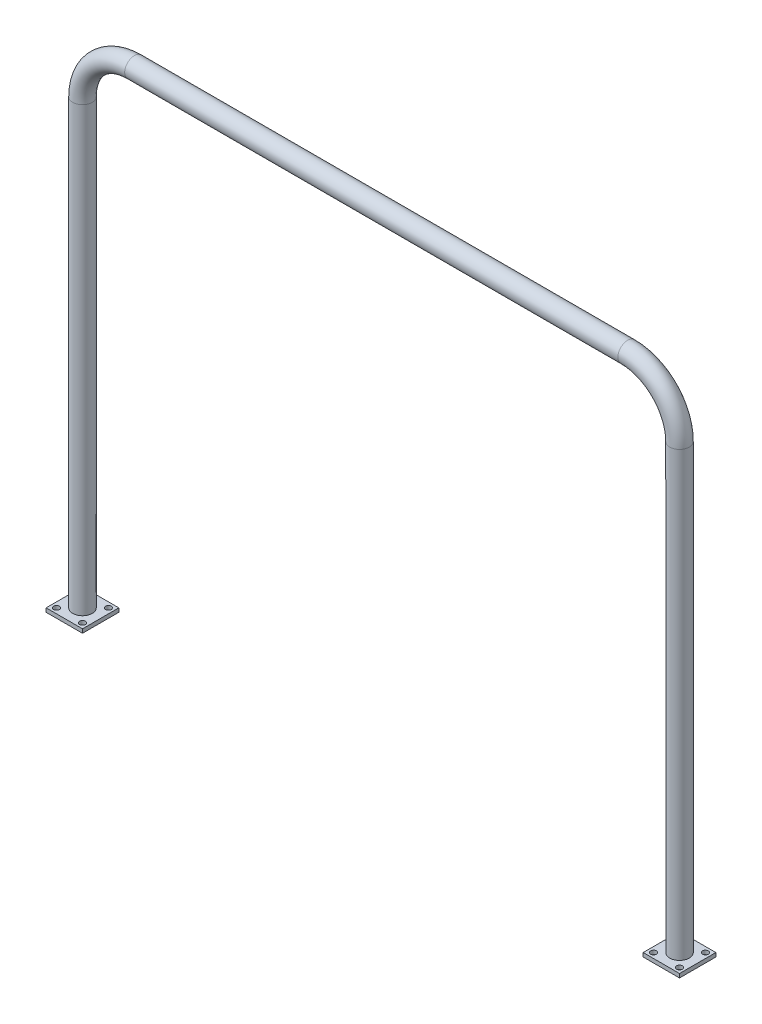
ISO-10303-21;
HEADER;
FILE_DESCRIPTION(('STEP AP214'),'2;1');
FILE_NAME('part.step','',(''),(''),'','','');
FILE_SCHEMA(('AUTOMOTIVE_DESIGN { 1 0 10303 214 1 1 1 1 }'));
ENDSEC;
DATA;
#1=APPLICATION_CONTEXT('core data for automotive mechanical design processes');
#2=APPLICATION_PROTOCOL_DEFINITION('international standard','automotive_design',2000,#1);
#3=PRODUCT_CONTEXT('',#1,'mechanical');
#4=PRODUCT('Part','Part','',(#3));
#5=PRODUCT_RELATED_PRODUCT_CATEGORY('part','',(#4));
#6=PRODUCT_DEFINITION_FORMATION('','',#4);
#7=PRODUCT_DEFINITION_CONTEXT('part definition',#1,'design');
#8=PRODUCT_DEFINITION('design','',#6,#7);
#9=PRODUCT_DEFINITION_SHAPE('','',#8);
#10=(LENGTH_UNIT() NAMED_UNIT(*) SI_UNIT(.MILLI.,.METRE.));
#11=(NAMED_UNIT(*) PLANE_ANGLE_UNIT() SI_UNIT($,.RADIAN.));
#12=(NAMED_UNIT(*) SI_UNIT($,.STERADIAN.) SOLID_ANGLE_UNIT());
#13=UNCERTAINTY_MEASURE_WITH_UNIT(LENGTH_MEASURE(1.E-05),#10,'distance_accuracy_value','');
#14=(GEOMETRIC_REPRESENTATION_CONTEXT(3) GLOBAL_UNCERTAINTY_ASSIGNED_CONTEXT((#13)) GLOBAL_UNIT_ASSIGNED_CONTEXT((#10,
#11,#12)) REPRESENTATION_CONTEXT('',''));
#15=CARTESIAN_POINT('',(0.,0.,0.));
#16=DIRECTION('',(0.,0.,1.));
#17=DIRECTION('',(1.,0.,0.));
#18=AXIS2_PLACEMENT_3D('',#15,#16,#17);
#19=CARTESIAN_POINT('',(-460.,0.,0.));
#20=DIRECTION('',(0.,1.,0.));
#21=DIRECTION('',(-1.,0.,0.));
#22=AXIS2_PLACEMENT_3D('',#19,#20,#21);
#23=CYLINDRICAL_SURFACE('',#22,15.);
#24=CARTESIAN_POINT('',(-460.000000000001,682.,0.));
#25=DIRECTION('',(0.,1.,0.));
#26=DIRECTION('',(0.,0.,1.));
#27=AXIS2_PLACEMENT_3D('',#24,#25,#26);
#28=CIRCLE('',#27,15.);
#29=CARTESIAN_POINT('',(-475.000000000001,681.999999999999,0.));
#30=VERTEX_POINT('',#29);
#31=EDGE_CURVE('E245',#30,#30,#28,.T.);
#32=ORIENTED_EDGE('',*,*,#31,.F.);
#33=EDGE_LOOP('',(#32));
#34=FACE_BOUND('',#33,.T.);
#35=CARTESIAN_POINT('',(-460.,0.,0.));
#36=DIRECTION('',(0.,1.,0.));
#37=DIRECTION('',(0.,0.,1.));
#38=AXIS2_PLACEMENT_3D('',#35,#36,#37);
#39=CIRCLE('',#38,15.);
#40=CARTESIAN_POINT('',(-460.,0.,15.));
#41=VERTEX_POINT('',#40);
#42=EDGE_CURVE('E233',#41,#41,#39,.T.);
#43=ORIENTED_EDGE('',*,*,#42,.T.);
#44=EDGE_LOOP('',(#43));
#45=FACE_BOUND('',#44,.T.);
#46=ADVANCED_FACE('F43',(#34,#45),#23,.T.);
#47=CARTESIAN_POINT('',(-380.,682.,0.));
#48=DIRECTION('',(0.,0.,-1.));
#49=DIRECTION('',(-1.,0.,0.));
#50=AXIS2_PLACEMENT_3D('',#47,#48,#49);
#51=TOROIDAL_SURFACE('',#50,80.0000000000003,15.);
#52=CARTESIAN_POINT('',(-380.,762.,0.));
#53=DIRECTION('',(1.,0.,0.));
#54=DIRECTION('',(0.,0.,1.));
#55=AXIS2_PLACEMENT_3D('',#52,#53,#54);
#56=CIRCLE('',#55,15.);
#57=CARTESIAN_POINT('',(-380.,777.,0.));
#58=VERTEX_POINT('',#57);
#59=EDGE_CURVE('E249',#58,#58,#56,.T.);
#60=CARTESIAN_POINT('',(-380.,682.,0.));
#61=DIRECTION('',(0.,0.,-1.));
#62=DIRECTION('',(-1.,0.,0.));
#63=AXIS2_PLACEMENT_3D('',#60,#61,#62);
#64=CIRCLE('',#63,95.0000000000003);
#65=EDGE_CURVE('',#30,#58,#64,.T.);
#66=ORIENTED_EDGE('',*,*,#31,.T.);
#67=ORIENTED_EDGE('',*,*,#59,.F.);
#68=ORIENTED_EDGE('',*,*,#65,.T.);
#69=ORIENTED_EDGE('',*,*,#65,.F.);
#70=EDGE_LOOP('',(#66,#68,#67,#69));
#71=FACE_BOUND('',#70,.T.);
#72=ADVANCED_FACE('F270',(#71),#51,.T.);
#73=CARTESIAN_POINT('',(-380.,762.,0.));
#74=DIRECTION('',(1.,0.,0.));
#75=DIRECTION('',(0.,0.,-1.));
#76=AXIS2_PLACEMENT_3D('',#73,#74,#75);
#77=CYLINDRICAL_SURFACE('',#76,15.);
#78=CARTESIAN_POINT('',(379.999999999999,762.,0.));
#79=DIRECTION('',(1.,0.,0.));
#80=DIRECTION('',(0.,0.,1.));
#81=AXIS2_PLACEMENT_3D('',#78,#79,#80);
#82=CIRCLE('',#81,15.);
#83=CARTESIAN_POINT('',(379.999999999999,777.,0.));
#84=VERTEX_POINT('',#83);
#85=EDGE_CURVE('E253',#84,#84,#82,.T.);
#86=ORIENTED_EDGE('',*,*,#85,.F.);
#87=EDGE_LOOP('',(#86));
#88=FACE_BOUND('',#87,.T.);
#89=ORIENTED_EDGE('',*,*,#59,.T.);
#90=EDGE_LOOP('',(#89));
#91=FACE_BOUND('',#90,.T.);
#92=ADVANCED_FACE('F265',(#88,#91),#77,.T.);
#93=CARTESIAN_POINT('',(380.,682.,0.));
#94=DIRECTION('',(0.,0.,-1.));
#95=DIRECTION('',(-1.,0.,0.));
#96=AXIS2_PLACEMENT_3D('',#93,#94,#95);
#97=TOROIDAL_SURFACE('',#96,80.0000000000003,15.);
#98=CARTESIAN_POINT('',(460.,682.,0.));
#99=DIRECTION('',(0.,-1.,0.));
#100=DIRECTION('',(0.,0.,1.));
#101=AXIS2_PLACEMENT_3D('',#98,#99,#100);
#102=CIRCLE('',#101,15.);
#103=CARTESIAN_POINT('',(475.,682.,0.));
#104=VERTEX_POINT('',#103);
#105=EDGE_CURVE('E54',#104,#104,#102,.T.);
#106=CARTESIAN_POINT('',(380.,682.,0.));
#107=DIRECTION('',(0.,0.,-1.));
#108=DIRECTION('',(-1.,0.,0.));
#109=AXIS2_PLACEMENT_3D('',#106,#107,#108);
#110=CIRCLE('',#109,95.0000000000003);
#111=EDGE_CURVE('',#84,#104,#110,.T.);
#112=ORIENTED_EDGE('',*,*,#85,.T.);
#113=ORIENTED_EDGE('',*,*,#105,.F.);
#114=ORIENTED_EDGE('',*,*,#111,.T.);
#115=ORIENTED_EDGE('',*,*,#111,.F.);
#116=EDGE_LOOP('',(#112,#114,#113,#115));
#117=FACE_BOUND('',#116,.T.);
#118=ADVANCED_FACE('F262',(#117),#97,.T.);
#119=CARTESIAN_POINT('',(460.,682.,0.));
#120=DIRECTION('',(0.,-1.,0.));
#121=DIRECTION('',(1.,0.,0.));
#122=AXIS2_PLACEMENT_3D('',#119,#120,#121);
#123=CYLINDRICAL_SURFACE('',#122,15.);
#124=CARTESIAN_POINT('',(460.,-1.12324616860903E-13,0.));
#125=DIRECTION('',(0.,-1.,0.));
#126=DIRECTION('',(0.,0.,1.));
#127=AXIS2_PLACEMENT_3D('',#124,#125,#126);
#128=CIRCLE('',#127,15.);
#129=CARTESIAN_POINT('',(460.,-1.12324616860903E-13,15.));
#130=VERTEX_POINT('',#129);
#131=EDGE_CURVE('E11',#130,#130,#128,.T.);
#132=ORIENTED_EDGE('',*,*,#131,.F.);
#133=EDGE_LOOP('',(#132));
#134=FACE_BOUND('',#133,.T.);
#135=ORIENTED_EDGE('',*,*,#105,.T.);
#136=EDGE_LOOP('',(#135));
#137=FACE_BOUND('',#136,.T.);
#138=ADVANCED_FACE('F45',(#134,#137),#123,.T.);
#139=CARTESIAN_POINT('',(-488.,-6.,-28.));
#140=DIRECTION('',(-1.,0.,0.));
#141=DIRECTION('',(0.,0.,1.));
#142=AXIS2_PLACEMENT_3D('',#139,#140,#141);
#143=PLANE('',#142);
#144=DIRECTION('',(0.,0.,1.));
#145=VECTOR('',#144,1.);
#146=CARTESIAN_POINT('',(-488.,0.,-28.));
#147=LINE('',#146,#145);
#148=CARTESIAN_POINT('',(-488.,0.,-28.));
#149=VERTEX_POINT('',#148);
#150=CARTESIAN_POINT('',(-488.,0.,28.));
#151=VERTEX_POINT('',#150);
#152=EDGE_CURVE('E205',#149,#151,#147,.T.);
#153=ORIENTED_EDGE('',*,*,#152,.F.);
#154=DIRECTION('',(0.,1.,0.));
#155=VECTOR('',#154,1.);
#156=CARTESIAN_POINT('',(-488.,-6.,-28.));
#157=LINE('',#156,#155);
#158=CARTESIAN_POINT('',(-488.,-6.,-28.));
#159=VERTEX_POINT('',#158);
#160=EDGE_CURVE('E62',#159,#149,#157,.T.);
#161=ORIENTED_EDGE('',*,*,#160,.F.);
#162=DIRECTION('',(0.,0.,1.));
#163=VECTOR('',#162,1.);
#164=CARTESIAN_POINT('',(-488.,-6.,-28.));
#165=LINE('',#164,#163);
#166=CARTESIAN_POINT('',(-488.,-6.,28.));
#167=VERTEX_POINT('',#166);
#168=EDGE_CURVE('E206',#159,#167,#165,.T.);
#169=ORIENTED_EDGE('',*,*,#168,.T.);
#170=DIRECTION('',(0.,1.,0.));
#171=VECTOR('',#170,1.);
#172=CARTESIAN_POINT('',(-488.,-6.,28.));
#173=LINE('',#172,#171);
#174=EDGE_CURVE('E88',#167,#151,#173,.T.);
#175=ORIENTED_EDGE('',*,*,#174,.T.);
#176=EDGE_LOOP('',(#153,#161,#169,#175));
#177=FACE_BOUND('',#176,.T.);
#178=ADVANCED_FACE('F282',(#177),#143,.T.);
#179=CARTESIAN_POINT('',(-488.,-6.,-28.));
#180=DIRECTION('',(0.,0.,1.));
#181=DIRECTION('',(1.,0.,0.));
#182=AXIS2_PLACEMENT_3D('',#179,#180,#181);
#183=PLANE('',#182);
#184=DIRECTION('',(1.,0.,0.));
#185=VECTOR('',#184,1.);
#186=CARTESIAN_POINT('',(-488.,0.,-28.));
#187=LINE('',#186,#185);
#188=CARTESIAN_POINT('',(-432.,0.,-28.));
#189=VERTEX_POINT('',#188);
#190=EDGE_CURVE('E80',#149,#189,#187,.T.);
#191=ORIENTED_EDGE('',*,*,#190,.T.);
#192=DIRECTION('',(0.,1.,0.));
#193=VECTOR('',#192,1.);
#194=CARTESIAN_POINT('',(-432.,-6.,-28.));
#195=LINE('',#194,#193);
#196=CARTESIAN_POINT('',(-432.,-6.,-28.));
#197=VERTEX_POINT('',#196);
#198=EDGE_CURVE('E234',#197,#189,#195,.T.);
#199=ORIENTED_EDGE('',*,*,#198,.F.);
#200=DIRECTION('',(1.,0.,0.));
#201=VECTOR('',#200,1.);
#202=CARTESIAN_POINT('',(-488.,-6.,-28.));
#203=LINE('',#202,#201);
#204=EDGE_CURVE('E215',#159,#197,#203,.T.);
#205=ORIENTED_EDGE('',*,*,#204,.F.);
#206=ORIENTED_EDGE('',*,*,#160,.T.);
#207=EDGE_LOOP('',(#191,#199,#205,#206));
#208=FACE_BOUND('',#207,.T.);
#209=ADVANCED_FACE('F299',(#208),#183,.F.);
#210=CARTESIAN_POINT('',(-432.,-6.,-28.));
#211=DIRECTION('',(-1.,0.,0.));
#212=DIRECTION('',(0.,0.,1.));
#213=AXIS2_PLACEMENT_3D('',#210,#211,#212);
#214=PLANE('',#213);
#215=DIRECTION('',(0.,0.,1.));
#216=VECTOR('',#215,1.);
#217=CARTESIAN_POINT('',(-432.,0.,-28.));
#218=LINE('',#217,#216);
#219=CARTESIAN_POINT('',(-432.,0.,28.));
#220=VERTEX_POINT('',#219);
#221=EDGE_CURVE('E225',#189,#220,#218,.T.);
#222=ORIENTED_EDGE('',*,*,#221,.T.);
#223=DIRECTION('',(0.,1.,0.));
#224=VECTOR('',#223,1.);
#225=CARTESIAN_POINT('',(-432.,-6.,28.));
#226=LINE('',#225,#224);
#227=CARTESIAN_POINT('',(-432.,-6.,28.));
#228=VERTEX_POINT('',#227);
#229=EDGE_CURVE('E237',#228,#220,#226,.T.);
#230=ORIENTED_EDGE('',*,*,#229,.F.);
#231=DIRECTION('',(0.,0.,1.));
#232=VECTOR('',#231,1.);
#233=CARTESIAN_POINT('',(-432.,-6.,-28.));
#234=LINE('',#233,#232);
#235=EDGE_CURVE('E212',#197,#228,#234,.T.);
#236=ORIENTED_EDGE('',*,*,#235,.F.);
#237=ORIENTED_EDGE('',*,*,#198,.T.);
#238=EDGE_LOOP('',(#222,#230,#236,#237));
#239=FACE_BOUND('',#238,.T.);
#240=ADVANCED_FACE('F298',(#239),#214,.F.);
#241=CARTESIAN_POINT('',(-488.,-6.,28.));
#242=DIRECTION('',(0.,0.,1.));
#243=DIRECTION('',(1.,0.,0.));
#244=AXIS2_PLACEMENT_3D('',#241,#242,#243);
#245=PLANE('',#244);
#246=DIRECTION('',(1.,0.,0.));
#247=VECTOR('',#246,1.);
#248=CARTESIAN_POINT('',(-488.,0.,28.));
#249=LINE('',#248,#247);
#250=EDGE_CURVE('E221',#151,#220,#249,.T.);
#251=ORIENTED_EDGE('',*,*,#250,.F.);
#252=ORIENTED_EDGE('',*,*,#174,.F.);
#253=DIRECTION('',(1.,0.,0.));
#254=VECTOR('',#253,1.);
#255=CARTESIAN_POINT('',(-488.,-6.,28.));
#256=LINE('',#255,#254);
#257=EDGE_CURVE('E209',#167,#228,#256,.T.);
#258=ORIENTED_EDGE('',*,*,#257,.T.);
#259=ORIENTED_EDGE('',*,*,#229,.T.);
#260=EDGE_LOOP('',(#251,#252,#258,#259));
#261=FACE_BOUND('',#260,.T.);
#262=ADVANCED_FACE('F294',(#261),#245,.T.);
#263=CARTESIAN_POINT('',(0.,-6.,0.));
#264=DIRECTION('',(0.,1.,0.));
#265=DIRECTION('',(0.,0.,1.));
#266=AXIS2_PLACEMENT_3D('',#263,#264,#265);
#267=PLANE('',#266);
#268=CARTESIAN_POINT('',(-440.,-6.,20.));
#269=DIRECTION('',(0.,1.,0.));
#270=DIRECTION('',(0.,0.,1.));
#271=AXIS2_PLACEMENT_3D('',#268,#269,#270);
#272=CIRCLE('',#271,4.5);
#273=CARTESIAN_POINT('',(-440.,-6.,24.5));
#274=VERTEX_POINT('',#273);
#275=EDGE_CURVE('E177',#274,#274,#272,.T.);
#276=ORIENTED_EDGE('',*,*,#275,.T.);
#277=EDGE_LOOP('',(#276));
#278=FACE_BOUND('',#277,.T.);
#279=CARTESIAN_POINT('',(-480.,-6.,-20.));
#280=DIRECTION('',(0.,1.,0.));
#281=DIRECTION('',(0.,0.,1.));
#282=AXIS2_PLACEMENT_3D('',#279,#280,#281);
#283=CIRCLE('',#282,4.5);
#284=CARTESIAN_POINT('',(-480.,-6.,-15.5));
#285=VERTEX_POINT('',#284);
#286=EDGE_CURVE('E185',#285,#285,#283,.T.);
#287=ORIENTED_EDGE('',*,*,#286,.T.);
#288=EDGE_LOOP('',(#287));
#289=FACE_BOUND('',#288,.T.);
#290=CARTESIAN_POINT('',(-480.,-6.,20.));
#291=DIRECTION('',(0.,1.,0.));
#292=DIRECTION('',(0.,0.,1.));
#293=AXIS2_PLACEMENT_3D('',#290,#291,#292);
#294=CIRCLE('',#293,4.5);
#295=CARTESIAN_POINT('',(-480.,-6.,24.5));
#296=VERTEX_POINT('',#295);
#297=EDGE_CURVE('E193',#296,#296,#294,.T.);
#298=ORIENTED_EDGE('',*,*,#297,.T.);
#299=EDGE_LOOP('',(#298));
#300=FACE_BOUND('',#299,.T.);
#301=CARTESIAN_POINT('',(-440.,-6.,-20.));
#302=DIRECTION('',(0.,1.,0.));
#303=DIRECTION('',(0.,0.,1.));
#304=AXIS2_PLACEMENT_3D('',#301,#302,#303);
#305=CIRCLE('',#304,4.5);
#306=CARTESIAN_POINT('',(-440.,-6.,-15.5));
#307=VERTEX_POINT('',#306);
#308=EDGE_CURVE('E201',#307,#307,#305,.T.);
#309=ORIENTED_EDGE('',*,*,#308,.T.);
#310=EDGE_LOOP('',(#309));
#311=FACE_BOUND('',#310,.T.);
#312=ORIENTED_EDGE('',*,*,#168,.F.);
#313=ORIENTED_EDGE('',*,*,#204,.T.);
#314=ORIENTED_EDGE('',*,*,#235,.T.);
#315=ORIENTED_EDGE('',*,*,#257,.F.);
#316=EDGE_LOOP('',(#312,#313,#314,#315));
#317=FACE_BOUND('',#316,.T.);
#318=ADVANCED_FACE('F289',(#278,#289,#300,#311,#317),#267,.F.);
#319=CARTESIAN_POINT('',(0.,0.,0.));
#320=DIRECTION('',(0.,1.,0.));
#321=DIRECTION('',(0.,0.,1.));
#322=AXIS2_PLACEMENT_3D('',#319,#320,#321);
#323=PLANE('',#322);
#324=CARTESIAN_POINT('',(-440.,0.,20.));
#325=DIRECTION('',(0.,1.,0.));
#326=DIRECTION('',(0.,0.,1.));
#327=AXIS2_PLACEMENT_3D('',#324,#325,#326);
#328=CIRCLE('',#327,4.5);
#329=CARTESIAN_POINT('',(-440.,0.,24.5));
#330=VERTEX_POINT('',#329);
#331=EDGE_CURVE('E168',#330,#330,#328,.T.);
#332=ORIENTED_EDGE('',*,*,#331,.F.);
#333=EDGE_LOOP('',(#332));
#334=FACE_BOUND('',#333,.T.);
#335=CARTESIAN_POINT('',(-480.,0.,-20.));
#336=DIRECTION('',(0.,1.,0.));
#337=DIRECTION('',(0.,0.,1.));
#338=AXIS2_PLACEMENT_3D('',#335,#336,#337);
#339=CIRCLE('',#338,4.5);
#340=CARTESIAN_POINT('',(-480.,0.,-15.5));
#341=VERTEX_POINT('',#340);
#342=EDGE_CURVE('E181',#341,#341,#339,.T.);
#343=ORIENTED_EDGE('',*,*,#342,.F.);
#344=EDGE_LOOP('',(#343));
#345=FACE_BOUND('',#344,.T.);
#346=CARTESIAN_POINT('',(-480.,0.,20.));
#347=DIRECTION('',(0.,1.,0.));
#348=DIRECTION('',(0.,0.,1.));
#349=AXIS2_PLACEMENT_3D('',#346,#347,#348);
#350=CIRCLE('',#349,4.5);
#351=CARTESIAN_POINT('',(-480.,0.,24.5));
#352=VERTEX_POINT('',#351);
#353=EDGE_CURVE('E189',#352,#352,#350,.T.);
#354=ORIENTED_EDGE('',*,*,#353,.F.);
#355=EDGE_LOOP('',(#354));
#356=FACE_BOUND('',#355,.T.);
#357=CARTESIAN_POINT('',(-440.,0.,-20.));
#358=DIRECTION('',(0.,1.,0.));
#359=DIRECTION('',(0.,0.,1.));
#360=AXIS2_PLACEMENT_3D('',#357,#358,#359);
#361=CIRCLE('',#360,4.5);
#362=CARTESIAN_POINT('',(-440.,0.,-15.5));
#363=VERTEX_POINT('',#362);
#364=EDGE_CURVE('E197',#363,#363,#361,.T.);
#365=ORIENTED_EDGE('',*,*,#364,.F.);
#366=EDGE_LOOP('',(#365));
#367=FACE_BOUND('',#366,.T.);
#368=ORIENTED_EDGE('',*,*,#42,.F.);
#369=EDGE_LOOP('',(#368));
#370=FACE_BOUND('',#369,.T.);
#371=ORIENTED_EDGE('',*,*,#152,.T.);
#372=ORIENTED_EDGE('',*,*,#250,.T.);
#373=ORIENTED_EDGE('',*,*,#221,.F.);
#374=ORIENTED_EDGE('',*,*,#190,.F.);
#375=EDGE_LOOP('',(#371,#372,#373,#374));
#376=FACE_BOUND('',#375,.T.);
#377=ADVANCED_FACE('F285',(#334,#345,#356,#367,#370,#376),#323,.T.);
#378=CARTESIAN_POINT('',(-440.,0.,-20.));
#379=DIRECTION('',(0.,1.,0.));
#380=DIRECTION('',(0.,0.,1.));
#381=AXIS2_PLACEMENT_3D('',#378,#379,#380);
#382=CYLINDRICAL_SURFACE('',#381,4.5);
#383=ORIENTED_EDGE('',*,*,#364,.T.);
#384=EDGE_LOOP('',(#383));
#385=FACE_BOUND('',#384,.T.);
#386=ORIENTED_EDGE('',*,*,#308,.F.);
#387=EDGE_LOOP('',(#386));
#388=FACE_BOUND('',#387,.T.);
#389=ADVANCED_FACE('F288',(#385,#388),#382,.F.);
#390=CARTESIAN_POINT('',(-480.,0.,20.));
#391=DIRECTION('',(0.,1.,0.));
#392=DIRECTION('',(0.,0.,1.));
#393=AXIS2_PLACEMENT_3D('',#390,#391,#392);
#394=CYLINDRICAL_SURFACE('',#393,4.5);
#395=ORIENTED_EDGE('',*,*,#353,.T.);
#396=EDGE_LOOP('',(#395));
#397=FACE_BOUND('',#396,.T.);
#398=ORIENTED_EDGE('',*,*,#297,.F.);
#399=EDGE_LOOP('',(#398));
#400=FACE_BOUND('',#399,.T.);
#401=ADVANCED_FACE('F348',(#397,#400),#394,.F.);
#402=CARTESIAN_POINT('',(-480.,0.,-20.));
#403=DIRECTION('',(0.,1.,0.));
#404=DIRECTION('',(0.,0.,1.));
#405=AXIS2_PLACEMENT_3D('',#402,#403,#404);
#406=CYLINDRICAL_SURFACE('',#405,4.5);
#407=ORIENTED_EDGE('',*,*,#342,.T.);
#408=EDGE_LOOP('',(#407));
#409=FACE_BOUND('',#408,.T.);
#410=ORIENTED_EDGE('',*,*,#286,.F.);
#411=EDGE_LOOP('',(#410));
#412=FACE_BOUND('',#411,.T.);
#413=ADVANCED_FACE('F344',(#409,#412),#406,.F.);
#414=CARTESIAN_POINT('',(-440.,0.,20.));
#415=DIRECTION('',(0.,1.,0.));
#416=DIRECTION('',(0.,0.,1.));
#417=AXIS2_PLACEMENT_3D('',#414,#415,#416);
#418=CYLINDRICAL_SURFACE('',#417,4.5);
#419=ORIENTED_EDGE('',*,*,#331,.T.);
#420=EDGE_LOOP('',(#419));
#421=FACE_BOUND('',#420,.T.);
#422=ORIENTED_EDGE('',*,*,#275,.F.);
#423=EDGE_LOOP('',(#422));
#424=FACE_BOUND('',#423,.T.);
#425=ADVANCED_FACE('F341',(#421,#424),#418,.F.);
#426=CARTESIAN_POINT('',(488.,-6.,-28.));
#427=DIRECTION('',(-1.,0.,0.));
#428=DIRECTION('',(0.,0.,1.));
#429=AXIS2_PLACEMENT_3D('',#426,#427,#428);
#430=PLANE('',#429);
#431=DIRECTION('',(0.,0.,1.));
#432=VECTOR('',#431,1.);
#433=CARTESIAN_POINT('',(488.,0.,-28.));
#434=LINE('',#433,#432);
#435=CARTESIAN_POINT('',(488.,0.,-28.));
#436=VERTEX_POINT('',#435);
#437=CARTESIAN_POINT('',(488.,0.,28.));
#438=VERTEX_POINT('',#437);
#439=EDGE_CURVE('E153',#436,#438,#434,.T.);
#440=ORIENTED_EDGE('',*,*,#439,.T.);
#441=DIRECTION('',(0.,1.,0.));
#442=VECTOR('',#441,1.);
#443=CARTESIAN_POINT('',(488.,-6.,28.));
#444=LINE('',#443,#442);
#445=CARTESIAN_POINT('',(488.,-6.,28.));
#446=VERTEX_POINT('',#445);
#447=EDGE_CURVE('E136',#446,#438,#444,.T.);
#448=ORIENTED_EDGE('',*,*,#447,.F.);
#449=DIRECTION('',(0.,0.,1.));
#450=VECTOR('',#449,1.);
#451=CARTESIAN_POINT('',(488.,-6.,-28.));
#452=LINE('',#451,#450);
#453=CARTESIAN_POINT('',(488.,-6.,-28.));
#454=VERTEX_POINT('',#453);
#455=EDGE_CURVE('E133',#454,#446,#452,.T.);
#456=ORIENTED_EDGE('',*,*,#455,.F.);
#457=DIRECTION('',(0.,1.,0.));
#458=VECTOR('',#457,1.);
#459=CARTESIAN_POINT('',(488.,-6.,-28.));
#460=LINE('',#459,#458);
#461=EDGE_CURVE('E117',#454,#436,#460,.T.);
#462=ORIENTED_EDGE('',*,*,#461,.T.);
#463=EDGE_LOOP('',(#440,#448,#456,#462));
#464=FACE_BOUND('',#463,.T.);
#465=ADVANCED_FACE('F134',(#464),#430,.F.);
#466=CARTESIAN_POINT('',(488.,-6.,28.));
#467=DIRECTION('',(0.,0.,-1.));
#468=DIRECTION('',(-1.,0.,0.));
#469=AXIS2_PLACEMENT_3D('',#466,#467,#468);
#470=PLANE('',#469);
#471=DIRECTION('',(-1.,0.,0.));
#472=VECTOR('',#471,1.);
#473=CARTESIAN_POINT('',(488.,0.,28.));
#474=LINE('',#473,#472);
#475=CARTESIAN_POINT('',(432.,0.,28.));
#476=VERTEX_POINT('',#475);
#477=EDGE_CURVE('E139',#438,#476,#474,.T.);
#478=ORIENTED_EDGE('',*,*,#477,.T.);
#479=DIRECTION('',(0.,1.,0.));
#480=VECTOR('',#479,1.);
#481=CARTESIAN_POINT('',(432.,-6.,28.));
#482=LINE('',#481,#480);
#483=CARTESIAN_POINT('',(432.,-6.,28.));
#484=VERTEX_POINT('',#483);
#485=EDGE_CURVE('E169',#484,#476,#482,.T.);
#486=ORIENTED_EDGE('',*,*,#485,.F.);
#487=DIRECTION('',(-1.,0.,0.));
#488=VECTOR('',#487,1.);
#489=CARTESIAN_POINT('',(488.,-6.,28.));
#490=LINE('',#489,#488);
#491=EDGE_CURVE('E129',#446,#484,#490,.T.);
#492=ORIENTED_EDGE('',*,*,#491,.F.);
#493=ORIENTED_EDGE('',*,*,#447,.T.);
#494=EDGE_LOOP('',(#478,#486,#492,#493));
#495=FACE_BOUND('',#494,.T.);
#496=ADVANCED_FACE('F327',(#495),#470,.F.);
#497=CARTESIAN_POINT('',(432.,-6.,-28.));
#498=DIRECTION('',(-1.,0.,0.));
#499=DIRECTION('',(0.,0.,1.));
#500=AXIS2_PLACEMENT_3D('',#497,#498,#499);
#501=PLANE('',#500);
#502=DIRECTION('',(0.,0.,1.));
#503=VECTOR('',#502,1.);
#504=CARTESIAN_POINT('',(432.,0.,-28.));
#505=LINE('',#504,#503);
#506=CARTESIAN_POINT('',(432.,0.,-28.));
#507=VERTEX_POINT('',#506);
#508=EDGE_CURVE('E159',#507,#476,#505,.T.);
#509=ORIENTED_EDGE('',*,*,#508,.F.);
#510=DIRECTION('',(0.,1.,0.));
#511=VECTOR('',#510,1.);
#512=CARTESIAN_POINT('',(432.,-6.,-28.));
#513=LINE('',#512,#511);
#514=CARTESIAN_POINT('',(432.,-6.,-28.));
#515=VERTEX_POINT('',#514);
#516=EDGE_CURVE('E128',#515,#507,#513,.T.);
#517=ORIENTED_EDGE('',*,*,#516,.F.);
#518=DIRECTION('',(0.,0.,1.));
#519=VECTOR('',#518,1.);
#520=CARTESIAN_POINT('',(432.,-6.,-28.));
#521=LINE('',#520,#519);
#522=EDGE_CURVE('E144',#515,#484,#521,.T.);
#523=ORIENTED_EDGE('',*,*,#522,.T.);
#524=ORIENTED_EDGE('',*,*,#485,.T.);
#525=EDGE_LOOP('',(#509,#517,#523,#524));
#526=FACE_BOUND('',#525,.T.);
#527=ADVANCED_FACE('F329',(#526),#501,.T.);
#528=CARTESIAN_POINT('',(488.,-6.,-28.));
#529=DIRECTION('',(0.,0.,-1.));
#530=DIRECTION('',(-1.,0.,0.));
#531=AXIS2_PLACEMENT_3D('',#528,#529,#530);
#532=PLANE('',#531);
#533=DIRECTION('',(-1.,0.,0.));
#534=VECTOR('',#533,1.);
#535=CARTESIAN_POINT('',(488.,0.,-28.));
#536=LINE('',#535,#534);
#537=EDGE_CURVE('E123',#436,#507,#536,.T.);
#538=ORIENTED_EDGE('',*,*,#537,.F.);
#539=ORIENTED_EDGE('',*,*,#461,.F.);
#540=DIRECTION('',(-1.,0.,0.));
#541=VECTOR('',#540,1.);
#542=CARTESIAN_POINT('',(488.,-6.,-28.));
#543=LINE('',#542,#541);
#544=EDGE_CURVE('E121',#454,#515,#543,.T.);
#545=ORIENTED_EDGE('',*,*,#544,.T.);
#546=ORIENTED_EDGE('',*,*,#516,.T.);
#547=EDGE_LOOP('',(#538,#539,#545,#546));
#548=FACE_BOUND('',#547,.T.);
#549=ADVANCED_FACE('F119',(#548),#532,.T.);
#550=CARTESIAN_POINT('',(0.,-6.,0.));
#551=DIRECTION('',(0.,1.,0.));
#552=DIRECTION('',(0.,0.,1.));
#553=AXIS2_PLACEMENT_3D('',#550,#551,#552);
#554=PLANE('',#553);
#555=CARTESIAN_POINT('',(440.,-6.,20.));
#556=DIRECTION('',(0.,1.,0.));
#557=DIRECTION('',(0.,0.,1.));
#558=AXIS2_PLACEMENT_3D('',#555,#556,#557);
#559=CIRCLE('',#558,4.5);
#560=CARTESIAN_POINT('',(440.,-6.,24.5));
#561=VERTEX_POINT('',#560);
#562=EDGE_CURVE('E581',#561,#561,#559,.T.);
#563=ORIENTED_EDGE('',*,*,#562,.T.);
#564=EDGE_LOOP('',(#563));
#565=FACE_BOUND('',#564,.T.);
#566=CARTESIAN_POINT('',(480.,-6.,-20.));
#567=DIRECTION('',(0.,1.,0.));
#568=DIRECTION('',(0.,0.,1.));
#569=AXIS2_PLACEMENT_3D('',#566,#567,#568);
#570=CIRCLE('',#569,4.5);
#571=CARTESIAN_POINT('',(480.,-6.,-15.5));
#572=VERTEX_POINT('',#571);
#573=EDGE_CURVE('E47',#572,#572,#570,.T.);
#574=ORIENTED_EDGE('',*,*,#573,.T.);
#575=EDGE_LOOP('',(#574));
#576=FACE_BOUND('',#575,.T.);
#577=CARTESIAN_POINT('',(480.,-6.,20.));
#578=DIRECTION('',(0.,1.,0.));
#579=DIRECTION('',(0.,0.,1.));
#580=AXIS2_PLACEMENT_3D('',#577,#578,#579);
#581=CIRCLE('',#580,4.5);
#582=CARTESIAN_POINT('',(480.,-6.,24.5));
#583=VERTEX_POINT('',#582);
#584=EDGE_CURVE('E595',#583,#583,#581,.T.);
#585=ORIENTED_EDGE('',*,*,#584,.T.);
#586=EDGE_LOOP('',(#585));
#587=FACE_BOUND('',#586,.T.);
#588=CARTESIAN_POINT('',(440.,-6.,-20.));
#589=DIRECTION('',(0.,1.,0.));
#590=DIRECTION('',(0.,0.,1.));
#591=AXIS2_PLACEMENT_3D('',#588,#589,#590);
#592=CIRCLE('',#591,4.5);
#593=CARTESIAN_POINT('',(440.,-6.,-15.5));
#594=VERTEX_POINT('',#593);
#595=EDGE_CURVE('E156',#594,#594,#592,.T.);
#596=ORIENTED_EDGE('',*,*,#595,.T.);
#597=EDGE_LOOP('',(#596));
#598=FACE_BOUND('',#597,.T.);
#599=ORIENTED_EDGE('',*,*,#455,.T.);
#600=ORIENTED_EDGE('',*,*,#491,.T.);
#601=ORIENTED_EDGE('',*,*,#522,.F.);
#602=ORIENTED_EDGE('',*,*,#544,.F.);
#603=EDGE_LOOP('',(#599,#600,#601,#602));
#604=FACE_BOUND('',#603,.T.);
#605=ADVANCED_FACE('F142',(#565,#576,#587,#598,#604),#554,.F.);
#606=CARTESIAN_POINT('',(0.,0.,0.));
#607=DIRECTION('',(0.,1.,0.));
#608=DIRECTION('',(0.,0.,1.));
#609=AXIS2_PLACEMENT_3D('',#606,#607,#608);
#610=PLANE('',#609);
#611=CARTESIAN_POINT('',(440.,0.,20.));
#612=DIRECTION('',(0.,1.,0.));
#613=DIRECTION('',(0.,0.,1.));
#614=AXIS2_PLACEMENT_3D('',#611,#612,#613);
#615=CIRCLE('',#614,4.5);
#616=CARTESIAN_POINT('',(440.,0.,24.5));
#617=VERTEX_POINT('',#616);
#618=EDGE_CURVE('E578',#617,#617,#615,.T.);
#619=ORIENTED_EDGE('',*,*,#618,.F.);
#620=EDGE_LOOP('',(#619));
#621=FACE_BOUND('',#620,.T.);
#622=CARTESIAN_POINT('',(480.,0.,-20.));
#623=DIRECTION('',(0.,1.,0.));
#624=DIRECTION('',(0.,0.,1.));
#625=AXIS2_PLACEMENT_3D('',#622,#623,#624);
#626=CIRCLE('',#625,4.5);
#627=CARTESIAN_POINT('',(480.,0.,-15.5));
#628=VERTEX_POINT('',#627);
#629=EDGE_CURVE('E583',#628,#628,#626,.T.);
#630=ORIENTED_EDGE('',*,*,#629,.F.);
#631=EDGE_LOOP('',(#630));
#632=FACE_BOUND('',#631,.T.);
#633=CARTESIAN_POINT('',(480.,0.,20.));
#634=DIRECTION('',(0.,1.,0.));
#635=DIRECTION('',(0.,0.,1.));
#636=AXIS2_PLACEMENT_3D('',#633,#634,#635);
#637=CIRCLE('',#636,4.5);
#638=CARTESIAN_POINT('',(480.,0.,24.5));
#639=VERTEX_POINT('',#638);
#640=EDGE_CURVE('E591',#639,#639,#637,.T.);
#641=ORIENTED_EDGE('',*,*,#640,.F.);
#642=EDGE_LOOP('',(#641));
#643=FACE_BOUND('',#642,.T.);
#644=CARTESIAN_POINT('',(440.,0.,-20.));
#645=DIRECTION('',(0.,1.,0.));
#646=DIRECTION('',(0.,0.,1.));
#647=AXIS2_PLACEMENT_3D('',#644,#645,#646);
#648=CIRCLE('',#647,4.5);
#649=CARTESIAN_POINT('',(440.,0.,-15.5));
#650=VERTEX_POINT('',#649);
#651=EDGE_CURVE('E599',#650,#650,#648,.T.);
#652=ORIENTED_EDGE('',*,*,#651,.F.);
#653=EDGE_LOOP('',(#652));
#654=FACE_BOUND('',#653,.T.);
#655=ORIENTED_EDGE('',*,*,#131,.T.);
#656=EDGE_LOOP('',(#655));
#657=FACE_BOUND('',#656,.T.);
#658=ORIENTED_EDGE('',*,*,#439,.F.);
#659=ORIENTED_EDGE('',*,*,#537,.T.);
#660=ORIENTED_EDGE('',*,*,#508,.T.);
#661=ORIENTED_EDGE('',*,*,#477,.F.);
#662=EDGE_LOOP('',(#658,#659,#660,#661));
#663=FACE_BOUND('',#662,.T.);
#664=ADVANCED_FACE('F318',(#621,#632,#643,#654,#657,#663),#610,.T.);
#665=CARTESIAN_POINT('',(440.,0.,-20.));
#666=DIRECTION('',(0.,1.,0.));
#667=DIRECTION('',(0.,0.,1.));
#668=AXIS2_PLACEMENT_3D('',#665,#666,#667);
#669=CYLINDRICAL_SURFACE('',#668,4.5);
#670=ORIENTED_EDGE('',*,*,#651,.T.);
#671=EDGE_LOOP('',(#670));
#672=FACE_BOUND('',#671,.T.);
#673=ORIENTED_EDGE('',*,*,#595,.F.);
#674=EDGE_LOOP('',(#673));
#675=FACE_BOUND('',#674,.T.);
#676=ADVANCED_FACE('F321',(#672,#675),#669,.F.);
#677=CARTESIAN_POINT('',(480.,0.,20.));
#678=DIRECTION('',(0.,1.,0.));
#679=DIRECTION('',(0.,0.,1.));
#680=AXIS2_PLACEMENT_3D('',#677,#678,#679);
#681=CYLINDRICAL_SURFACE('',#680,4.5);
#682=ORIENTED_EDGE('',*,*,#640,.T.);
#683=EDGE_LOOP('',(#682));
#684=FACE_BOUND('',#683,.T.);
#685=ORIENTED_EDGE('',*,*,#584,.F.);
#686=EDGE_LOOP('',(#685));
#687=FACE_BOUND('',#686,.T.);
#688=ADVANCED_FACE('F422',(#684,#687),#681,.F.);
#689=CARTESIAN_POINT('',(480.,0.,-20.));
#690=DIRECTION('',(0.,1.,0.));
#691=DIRECTION('',(0.,0.,1.));
#692=AXIS2_PLACEMENT_3D('',#689,#690,#691);
#693=CYLINDRICAL_SURFACE('',#692,4.5);
#694=ORIENTED_EDGE('',*,*,#629,.T.);
#695=EDGE_LOOP('',(#694));
#696=FACE_BOUND('',#695,.T.);
#697=ORIENTED_EDGE('',*,*,#573,.F.);
#698=EDGE_LOOP('',(#697));
#699=FACE_BOUND('',#698,.T.);
#700=ADVANCED_FACE('F433',(#696,#699),#693,.F.);
#701=CARTESIAN_POINT('',(440.,0.,20.));
#702=DIRECTION('',(0.,1.,0.));
#703=DIRECTION('',(0.,0.,1.));
#704=AXIS2_PLACEMENT_3D('',#701,#702,#703);
#705=CYLINDRICAL_SURFACE('',#704,4.5);
#706=ORIENTED_EDGE('',*,*,#618,.T.);
#707=EDGE_LOOP('',(#706));
#708=FACE_BOUND('',#707,.T.);
#709=ORIENTED_EDGE('',*,*,#562,.F.);
#710=EDGE_LOOP('',(#709));
#711=FACE_BOUND('',#710,.T.);
#712=ADVANCED_FACE('F444',(#708,#711),#705,.F.);
#713=CLOSED_SHELL('',(#46,#72,#92,#118,#138,#178,#209,#240,#262,#318,#377,#389,#401,#413,#425,
#465,#496,#527,#549,#605,#664,#676,#688,#700,#712));
#714=MANIFOLD_SOLID_BREP('B2',#713);
#715=ADVANCED_BREP_SHAPE_REPRESENTATION('',(#18,#714),#14);
#716=SHAPE_DEFINITION_REPRESENTATION(#9,#715);
ENDSEC;
END-ISO-10303-21;
